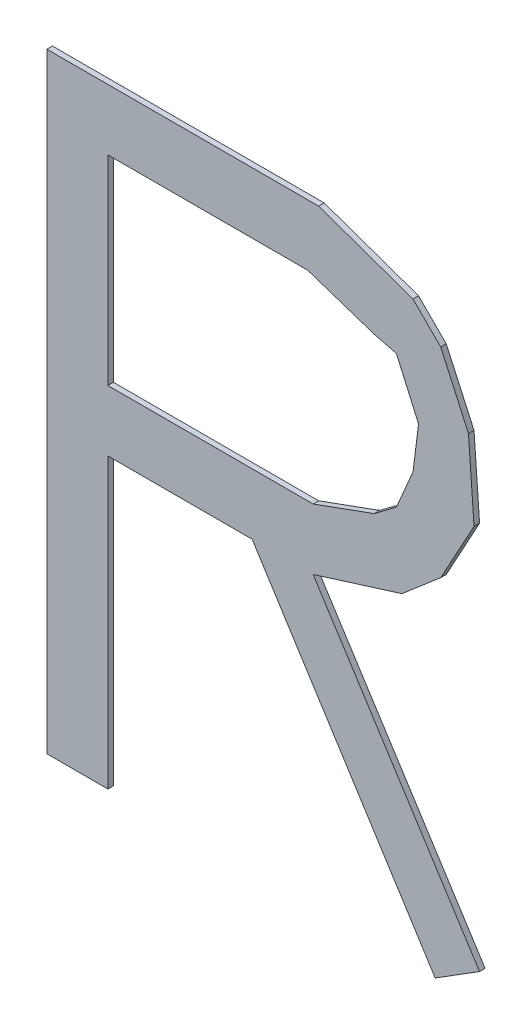
ISO-10303-21;
HEADER;
FILE_DESCRIPTION(('STEP AP214'),'2;1');
FILE_NAME('part.step','',(''),(''),'','','');
FILE_SCHEMA(('AUTOMOTIVE_DESIGN { 1 0 10303 214 1 1 1 1 }'));
ENDSEC;
DATA;
#1=APPLICATION_CONTEXT('core data for automotive mechanical design processes');
#2=APPLICATION_PROTOCOL_DEFINITION('international standard','automotive_design',2000,#1);
#3=PRODUCT_CONTEXT('',#1,'mechanical');
#4=PRODUCT('Part','Part','',(#3));
#5=PRODUCT_RELATED_PRODUCT_CATEGORY('part','',(#4));
#6=PRODUCT_DEFINITION_FORMATION('','',#4);
#7=PRODUCT_DEFINITION_CONTEXT('part definition',#1,'design');
#8=PRODUCT_DEFINITION('design','',#6,#7);
#9=PRODUCT_DEFINITION_SHAPE('','',#8);
#10=(LENGTH_UNIT() NAMED_UNIT(*) SI_UNIT(.MILLI.,.METRE.));
#11=(NAMED_UNIT(*) PLANE_ANGLE_UNIT() SI_UNIT($,.RADIAN.));
#12=(NAMED_UNIT(*) SI_UNIT($,.STERADIAN.) SOLID_ANGLE_UNIT());
#13=UNCERTAINTY_MEASURE_WITH_UNIT(LENGTH_MEASURE(1.E-05),#10,'distance_accuracy_value','');
#14=(GEOMETRIC_REPRESENTATION_CONTEXT(3) GLOBAL_UNCERTAINTY_ASSIGNED_CONTEXT((#13)) GLOBAL_UNIT_ASSIGNED_CONTEXT((#10,
#11,#12)) REPRESENTATION_CONTEXT('',''));
#15=CARTESIAN_POINT('',(0.,0.,0.));
#16=DIRECTION('',(0.,0.,1.));
#17=DIRECTION('',(1.,0.,0.));
#18=AXIS2_PLACEMENT_3D('',#15,#16,#17);
#19=CARTESIAN_POINT('',(-0.27999944,-0.02999994,0.));
#20=DIRECTION('',(-1.,0.,0.));
#21=DIRECTION('',(0.,0.,1.));
#22=AXIS2_PLACEMENT_3D('',#19,#20,#21);
#23=PLANE('',#22);
#24=DIRECTION('',(0.,0.,1.));
#25=VECTOR('',#24,1.);
#26=CARTESIAN_POINT('',(-0.27999944,0.07999984,0.));
#27=LINE('',#26,#25);
#28=CARTESIAN_POINT('',(-0.27999944,0.07999984,0.));
#29=VERTEX_POINT('',#28);
#30=CARTESIAN_POINT('',(-0.27999944,0.07999984,0.01));
#31=VERTEX_POINT('',#30);
#32=EDGE_CURVE('E331',#29,#31,#27,.T.);
#33=ORIENTED_EDGE('',*,*,#32,.F.);
#34=DIRECTION('',(0.,1.,0.));
#35=VECTOR('',#34,1.);
#36=CARTESIAN_POINT('',(-0.27999944,0.44000166,0.));
#37=LINE('',#36,#35);
#38=CARTESIAN_POINT('',(-0.27999944,-0.02999994,0.));
#39=VERTEX_POINT('',#38);
#40=EDGE_CURVE('E326',#39,#29,#37,.T.);
#41=ORIENTED_EDGE('',*,*,#40,.F.);
#42=DIRECTION('',(0.,0.,-1.));
#43=VECTOR('',#42,1.);
#44=CARTESIAN_POINT('',(-0.27999944,-0.02999994,0.));
#45=LINE('',#44,#43);
#46=CARTESIAN_POINT('',(-0.27999944,-0.02999994,0.01));
#47=VERTEX_POINT('',#46);
#48=EDGE_CURVE('E322',#47,#39,#45,.T.);
#49=ORIENTED_EDGE('',*,*,#48,.F.);
#50=DIRECTION('',(0.,1.,0.));
#51=VECTOR('',#50,1.);
#52=CARTESIAN_POINT('',(-0.27999944,0.44000166,0.01));
#53=LINE('',#52,#51);
#54=EDGE_CURVE('E212',#31,#47,#53,.F.);
#55=ORIENTED_EDGE('',*,*,#54,.F.);
#56=EDGE_LOOP('',(#33,#41,#49,#55));
#57=FACE_BOUND('',#56,.T.);
#58=ADVANCED_FACE('F17',(#57),#23,.T.);
#59=CARTESIAN_POINT('',(-0.38999922,-0.5499989,0.01));
#60=DIRECTION('',(0.,0.,1.));
#61=DIRECTION('',(1.,0.,0.));
#62=AXIS2_PLACEMENT_3D('',#59,#60,#61);
#63=PLANE('',#62);
#64=DIRECTION('',(0.,1.,0.));
#65=VECTOR('',#64,1.);
#66=CARTESIAN_POINT('',(-0.38999922,-0.5499989,0.01));
#67=LINE('',#66,#65);
#68=CARTESIAN_POINT('',(-0.38999922,-0.5499989,0.01));
#69=VERTEX_POINT('',#68);
#70=CARTESIAN_POINT('',(-0.38999922,0.55000144,0.01));
#71=VERTEX_POINT('',#70);
#72=EDGE_CURVE('E286',#69,#71,#67,.T.);
#73=ORIENTED_EDGE('',*,*,#72,.F.);
#74=DIRECTION('',(1.,0.,0.));
#75=VECTOR('',#74,1.);
#76=CARTESIAN_POINT('',(-0.27999944,-0.5499989,0.01));
#77=LINE('',#76,#75);
#78=CARTESIAN_POINT('',(-0.27999944,-0.5499989,0.01));
#79=VERTEX_POINT('',#78);
#80=EDGE_CURVE('E283',#79,#69,#77,.F.);
#81=ORIENTED_EDGE('',*,*,#80,.F.);
#82=DIRECTION('',(0.,1.,0.));
#83=VECTOR('',#82,1.);
#84=CARTESIAN_POINT('',(-0.27999944,0.44000166,0.01));
#85=LINE('',#84,#83);
#86=EDGE_CURVE('E213',#47,#79,#85,.F.);
#87=ORIENTED_EDGE('',*,*,#86,.F.);
#88=DIRECTION('',(1.,0.,0.));
#89=VECTOR('',#88,1.);
#90=CARTESIAN_POINT('',(-0.01999995999998,-0.02999994,0.01));
#91=LINE('',#90,#89);
#92=CARTESIAN_POINT('',(-0.0199999599997233,-0.0299999399999323,0.01));
#93=VERTEX_POINT('',#92);
#94=EDGE_CURVE('E323',#93,#47,#91,.F.);
#95=ORIENTED_EDGE('',*,*,#94,.F.);
#96=DIRECTION('',(0.535824439731107,-0.844329420183168,0.));
#97=VECTOR('',#96,1.);
#98=CARTESIAN_POINT('',(0.30999938,-0.5499989,0.01));
#99=LINE('',#98,#97);
#100=CARTESIAN_POINT('',(0.309999379999995,-0.549998899999992,0.01));
#101=VERTEX_POINT('',#100);
#102=EDGE_CURVE('E320',#101,#93,#99,.F.);
#103=ORIENTED_EDGE('',*,*,#102,.F.);
#104=DIRECTION('',(0.847998304005144,0.52999894000309,0.));
#105=VECTOR('',#104,1.);
#106=CARTESIAN_POINT('',(0.38999922,-0.499999,0.01));
#107=LINE('',#106,#105);
#108=CARTESIAN_POINT('',(0.389999219999949,-0.499999000000032,0.01));
#109=VERTEX_POINT('',#108);
#110=EDGE_CURVE('E317',#109,#101,#107,.F.);
#111=ORIENTED_EDGE('',*,*,#110,.F.);
#112=DIRECTION('',(-0.538035452921774,0.842922209577646,0.));
#113=VECTOR('',#112,1.);
#114=CARTESIAN_POINT('',(0.08999982,-0.02999994,0.01));
#115=LINE('',#114,#113);
#116=CARTESIAN_POINT('',(0.0899998200000002,-0.0299999400000004,0.01));
#117=VERTEX_POINT('',#116);
#118=EDGE_CURVE('E314',#117,#109,#115,.F.);
#119=ORIENTED_EDGE('',*,*,#118,.F.);
#120=DIRECTION('',(0.954479978035012,0.298274993136004,0.));
#121=VECTOR('',#120,1.);
#122=CARTESIAN_POINT('',(0.2499995,0.01999996000001,0.01));
#123=LINE('',#122,#121);
#124=CARTESIAN_POINT('',(0.249999500000042,0.01999996000001,0.01));
#125=VERTEX_POINT('',#124);
#126=EDGE_CURVE('E311',#125,#117,#123,.F.);
#127=ORIENTED_EDGE('',*,*,#126,.F.);
#128=DIRECTION('',(0.759256602365155,0.650791373456133,0.));
#129=VECTOR('',#128,1.);
#130=CARTESIAN_POINT('',(0.31999936,0.07999984,0.01));
#131=LINE('',#130,#129);
#132=CARTESIAN_POINT('',(0.319999359999925,0.0799998399999664,0.01));
#133=VERTEX_POINT('',#132);
#134=EDGE_CURVE('E308',#133,#125,#131,.F.);
#135=ORIENTED_EDGE('',*,*,#134,.F.);
#136=DIRECTION('',(0.478843609055052,0.877900221020095,0.));
#137=VECTOR('',#136,1.);
#138=CARTESIAN_POINT('',(0.37999924,0.19000216,0.01));
#139=LINE('',#138,#137);
#140=CARTESIAN_POINT('',(0.379999239999999,0.190002159999999,0.01));
#141=VERTEX_POINT('',#140);
#142=EDGE_CURVE('E305',#141,#133,#139,.F.);
#143=ORIENTED_EDGE('',*,*,#142,.F.);
#144=DIRECTION('',(-0.0712470499879011,0.997458699830736,0.));
#145=VECTOR('',#144,1.);
#146=CARTESIAN_POINT('',(0.36999926,0.33000188,0.01));
#147=LINE('',#146,#145);
#148=CARTESIAN_POINT('',(0.369999259999986,0.330001879999934,0.01));
#149=VERTEX_POINT('',#148);
#150=EDGE_CURVE('E302',#149,#141,#147,.F.);
#151=ORIENTED_EDGE('',*,*,#150,.F.);
#152=DIRECTION('',(-0.413802944300883,0.910366477462742,0.));
#153=VECTOR('',#152,1.);
#154=CARTESIAN_POINT('',(0.31999936,0.44000166,0.01));
#155=LINE('',#154,#153);
#156=CARTESIAN_POINT('',(0.319999359999988,0.440001660000083,0.01));
#157=VERTEX_POINT('',#156);
#158=EDGE_CURVE('E299',#157,#149,#155,.F.);
#159=ORIENTED_EDGE('',*,*,#158,.F.);
#160=DIRECTION('',(-0.707106781187048,0.707106781186048,0.));
#161=VECTOR('',#160,1.);
#162=CARTESIAN_POINT('',(0.26999946,0.49000156,0.01));
#163=LINE('',#162,#161);
#164=CARTESIAN_POINT('',(0.269999459999978,0.490001560000043,0.01));
#165=VERTEX_POINT('',#164);
#166=EDGE_CURVE('E296',#165,#157,#163,.F.);
#167=ORIENTED_EDGE('',*,*,#166,.F.);
#168=DIRECTION('',(-0.942990333582945,0.332820117734981,0.));
#169=VECTOR('',#168,1.);
#170=CARTESIAN_POINT('',(0.09999980000001,0.55000144,0.01));
#171=LINE('',#170,#169);
#172=CARTESIAN_POINT('',(0.09999980000001,0.55000144,0.01));
#173=VERTEX_POINT('',#172);
#174=EDGE_CURVE('E293',#173,#165,#171,.F.);
#175=ORIENTED_EDGE('',*,*,#174,.F.);
#176=DIRECTION('',(1.,0.,0.));
#177=VECTOR('',#176,1.);
#178=CARTESIAN_POINT('',(-0.38999922,0.55000144,0.01));
#179=LINE('',#178,#177);
#180=EDGE_CURVE('E290',#71,#173,#179,.T.);
#181=ORIENTED_EDGE('',*,*,#180,.F.);
#182=EDGE_LOOP('',(#73,#81,#87,#95,#103,#111,#119,#127,#135,#143,#151,#159,#167,#175,#181));
#183=FACE_BOUND('',#182,.T.);
#184=DIRECTION('',(-0.939793423488291,-0.341743063087106,0.));
#185=VECTOR('',#184,1.);
#186=CARTESIAN_POINT('',(0.08999982,0.07999984,0.01));
#187=LINE('',#186,#185);
#188=CARTESIAN_POINT('',(0.0899998199999998,0.07999984,0.01));
#189=VERTEX_POINT('',#188);
#190=CARTESIAN_POINT('',(0.19999960000006,0.119999760000075,0.01));
#191=VERTEX_POINT('',#190);
#192=EDGE_CURVE('E332',#189,#191,#187,.F.);
#193=ORIENTED_EDGE('',*,*,#192,.F.);
#194=DIRECTION('',(1.,0.,0.));
#195=VECTOR('',#194,1.);
#196=CARTESIAN_POINT('',(-0.27999944,0.07999984,0.01));
#197=LINE('',#196,#195);
#198=EDGE_CURVE('E329',#31,#189,#197,.T.);
#199=ORIENTED_EDGE('',*,*,#198,.F.);
#200=DIRECTION('',(0.,1.,0.));
#201=VECTOR('',#200,1.);
#202=CARTESIAN_POINT('',(-0.27999944,0.44000166,0.01));
#203=LINE('',#202,#201);
#204=CARTESIAN_POINT('',(-0.27999944,0.44000166,0.01));
#205=VERTEX_POINT('',#204);
#206=EDGE_CURVE('E196',#205,#31,#203,.F.);
#207=ORIENTED_EDGE('',*,*,#206,.F.);
#208=DIRECTION('',(1.,0.,0.));
#209=VECTOR('',#208,1.);
#210=CARTESIAN_POINT('',(0.07999984000003,0.44000166,0.01));
#211=LINE('',#210,#209);
#212=CARTESIAN_POINT('',(0.0799998400000135,0.440001659999996,0.01));
#213=VERTEX_POINT('',#212);
#214=EDGE_CURVE('E20',#213,#205,#211,.F.);
#215=ORIENTED_EDGE('',*,*,#214,.F.);
#216=DIRECTION('',(0.948683298050514,-0.316227766016838,0.));
#217=VECTOR('',#216,1.);
#218=CARTESIAN_POINT('',(0.1999996,0.40000174,0.01));
#219=LINE('',#218,#217);
#220=CARTESIAN_POINT('',(0.199999600000061,0.400001739999974,0.01));
#221=VERTEX_POINT('',#220);
#222=EDGE_CURVE('E180',#221,#213,#219,.F.);
#223=ORIENTED_EDGE('',*,*,#222,.F.);
#224=DIRECTION('',(0.970142500145391,-0.242535625036098,0.));
#225=VECTOR('',#224,1.);
#226=CARTESIAN_POINT('',(0.23999952,0.39000176,0.01));
#227=LINE('',#226,#225);
#228=CARTESIAN_POINT('',(0.239999520000032,0.390001760000001,0.01));
#229=VERTEX_POINT('',#228);
#230=EDGE_CURVE('E203',#229,#221,#227,.F.);
#231=ORIENTED_EDGE('',*,*,#230,.F.);
#232=DIRECTION('',(0.406138466053169,-0.913811548620381,0.));
#233=VECTOR('',#232,1.);
#234=CARTESIAN_POINT('',(0.27999944,0.30000194,0.01));
#235=LINE('',#234,#233);
#236=CARTESIAN_POINT('',(0.279999439999982,0.300001940000019,0.01));
#237=VERTEX_POINT('',#236);
#238=EDGE_CURVE('E345',#237,#229,#235,.F.);
#239=ORIENTED_EDGE('',*,*,#238,.F.);
#240=DIRECTION('',(-0.124034734588962,-0.992277876713698,0.));
#241=VECTOR('',#240,1.);
#242=CARTESIAN_POINT('',(0.26999946,0.2200021,0.01));
#243=LINE('',#242,#241);
#244=CARTESIAN_POINT('',(0.269999459999997,0.220002100000024,0.01));
#245=VERTEX_POINT('',#244);
#246=EDGE_CURVE('E342',#245,#237,#243,.F.);
#247=ORIENTED_EDGE('',*,*,#246,.F.);
#248=DIRECTION('',(-0.393907223227035,-0.919150205075083,0.));
#249=VECTOR('',#248,1.);
#250=CARTESIAN_POINT('',(0.23999952,0.1499997,0.01));
#251=LINE('',#250,#249);
#252=CARTESIAN_POINT('',(0.23999952,0.1499997,0.01));
#253=VERTEX_POINT('',#252);
#254=EDGE_CURVE('E339',#253,#245,#251,.F.);
#255=ORIENTED_EDGE('',*,*,#254,.F.);
#256=DIRECTION('',(-0.8,-0.6,0.));
#257=VECTOR('',#256,1.);
#258=CARTESIAN_POINT('',(0.1999996,0.11999976,0.01));
#259=LINE('',#258,#257);
#260=EDGE_CURVE('E336',#191,#253,#259,.F.);
#261=ORIENTED_EDGE('',*,*,#260,.F.);
#262=EDGE_LOOP('',(#193,#199,#207,#215,#223,#231,#239,#247,#255,#261));
#263=FACE_BOUND('',#262,.T.);
#264=ADVANCED_FACE('F193',(#183,#263),#63,.T.);
#265=CARTESIAN_POINT('',(0.07999984000003,0.44000166,0.));
#266=DIRECTION('',(0.,-1.,0.));
#267=DIRECTION('',(0.,0.,-1.));
#268=AXIS2_PLACEMENT_3D('',#265,#266,#267);
#269=PLANE('',#268);
#270=DIRECTION('',(0.,0.,-1.));
#271=VECTOR('',#270,1.);
#272=CARTESIAN_POINT('',(-0.27999944,0.44000166,0.));
#273=LINE('',#272,#271);
#274=CARTESIAN_POINT('',(-0.27999944,0.44000166,0.));
#275=VERTEX_POINT('',#274);
#276=EDGE_CURVE('E209',#275,#205,#273,.F.);
#277=ORIENTED_EDGE('',*,*,#276,.F.);
#278=DIRECTION('',(1.,0.,0.));
#279=VECTOR('',#278,1.);
#280=CARTESIAN_POINT('',(0.07999984000003,0.44000166,0.));
#281=LINE('',#280,#279);
#282=CARTESIAN_POINT('',(0.0799998400000135,0.440001659999996,0.));
#283=VERTEX_POINT('',#282);
#284=EDGE_CURVE('E202',#275,#283,#281,.T.);
#285=ORIENTED_EDGE('',*,*,#284,.T.);
#286=DIRECTION('',(0.,0.,1.));
#287=VECTOR('',#286,1.);
#288=CARTESIAN_POINT('',(0.079999840000027,0.440001659999991,0.));
#289=LINE('',#288,#287);
#290=EDGE_CURVE('E185',#213,#283,#289,.F.);
#291=ORIENTED_EDGE('',*,*,#290,.F.);
#292=ORIENTED_EDGE('',*,*,#214,.T.);
#293=EDGE_LOOP('',(#277,#285,#291,#292));
#294=FACE_BOUND('',#293,.T.);
#295=ADVANCED_FACE('F200',(#294),#269,.T.);
#296=CARTESIAN_POINT('',(0.1999996,0.40000174,0.));
#297=DIRECTION('',(-0.316227766016838,-0.948683298050514,0.));
#298=DIRECTION('',(0.948683298050514,-0.316227766016838,0.));
#299=AXIS2_PLACEMENT_3D('',#296,#297,#298);
#300=PLANE('',#299);
#301=ORIENTED_EDGE('',*,*,#290,.T.);
#302=DIRECTION('',(0.948683298050514,-0.316227766016838,0.));
#303=VECTOR('',#302,1.);
#304=CARTESIAN_POINT('',(0.1999996,0.40000174,0.));
#305=LINE('',#304,#303);
#306=CARTESIAN_POINT('',(0.199999600000061,0.400001739999974,0.));
#307=VERTEX_POINT('',#306);
#308=EDGE_CURVE('E277',#283,#307,#305,.T.);
#309=ORIENTED_EDGE('',*,*,#308,.T.);
#310=DIRECTION('',(0.,0.,1.));
#311=VECTOR('',#310,1.);
#312=CARTESIAN_POINT('',(0.199999599999998,0.40000173999999,0.));
#313=LINE('',#312,#311);
#314=EDGE_CURVE('E187',#221,#307,#313,.F.);
#315=ORIENTED_EDGE('',*,*,#314,.F.);
#316=ORIENTED_EDGE('',*,*,#222,.T.);
#317=EDGE_LOOP('',(#301,#309,#315,#316));
#318=FACE_BOUND('',#317,.T.);
#319=ADVANCED_FACE('F182',(#318),#300,.T.);
#320=CARTESIAN_POINT('',(0.23999952,0.39000176,0.));
#321=DIRECTION('',(-0.242535625036098,-0.970142500145391,0.));
#322=DIRECTION('',(0.970142500145391,-0.242535625036098,0.));
#323=AXIS2_PLACEMENT_3D('',#320,#321,#322);
#324=PLANE('',#323);
#325=ORIENTED_EDGE('',*,*,#314,.T.);
#326=DIRECTION('',(0.970142500145391,-0.242535625036098,0.));
#327=VECTOR('',#326,1.);
#328=CARTESIAN_POINT('',(0.23999952,0.39000176,0.));
#329=LINE('',#328,#327);
#330=CARTESIAN_POINT('',(0.239999520000032,0.390001760000001,0.));
#331=VERTEX_POINT('',#330);
#332=EDGE_CURVE('E274',#307,#331,#329,.T.);
#333=ORIENTED_EDGE('',*,*,#332,.T.);
#334=DIRECTION('',(0.,0.,1.));
#335=VECTOR('',#334,1.);
#336=CARTESIAN_POINT('',(0.239999520000027,0.390001760000012,0.));
#337=LINE('',#336,#335);
#338=EDGE_CURVE('E344',#229,#331,#337,.F.);
#339=ORIENTED_EDGE('',*,*,#338,.F.);
#340=ORIENTED_EDGE('',*,*,#230,.T.);
#341=EDGE_LOOP('',(#325,#333,#339,#340));
#342=FACE_BOUND('',#341,.T.);
#343=ADVANCED_FACE('F351',(#342),#324,.T.);
#344=CARTESIAN_POINT('',(0.27999944,0.30000194,0.));
#345=DIRECTION('',(-0.913811548620381,-0.406138466053169,0.));
#346=DIRECTION('',(0.406138466053169,-0.913811548620381,0.));
#347=AXIS2_PLACEMENT_3D('',#344,#345,#346);
#348=PLANE('',#347);
#349=ORIENTED_EDGE('',*,*,#338,.T.);
#350=DIRECTION('',(0.406138466053169,-0.913811548620381,0.));
#351=VECTOR('',#350,1.);
#352=CARTESIAN_POINT('',(0.27999944,0.30000194,0.));
#353=LINE('',#352,#351);
#354=CARTESIAN_POINT('',(0.279999439999982,0.300001940000019,0.));
#355=VERTEX_POINT('',#354);
#356=EDGE_CURVE('E271',#331,#355,#353,.T.);
#357=ORIENTED_EDGE('',*,*,#356,.T.);
#358=DIRECTION('',(0.,0.,1.));
#359=VECTOR('',#358,1.);
#360=CARTESIAN_POINT('',(0.27999943999998,0.300001940000003,0.));
#361=LINE('',#360,#359);
#362=EDGE_CURVE('E341',#237,#355,#361,.F.);
#363=ORIENTED_EDGE('',*,*,#362,.F.);
#364=ORIENTED_EDGE('',*,*,#238,.T.);
#365=EDGE_LOOP('',(#349,#357,#363,#364));
#366=FACE_BOUND('',#365,.T.);
#367=ADVANCED_FACE('F359',(#366),#348,.T.);
#368=CARTESIAN_POINT('',(0.26999946,0.2200021,0.));
#369=DIRECTION('',(-0.992277876713698,0.124034734588962,0.));
#370=DIRECTION('',(-0.124034734588962,-0.992277876713698,0.));
#371=AXIS2_PLACEMENT_3D('',#368,#369,#370);
#372=PLANE('',#371);
#373=ORIENTED_EDGE('',*,*,#362,.T.);
#374=DIRECTION('',(-0.124034734588962,-0.992277876713698,0.));
#375=VECTOR('',#374,1.);
#376=CARTESIAN_POINT('',(0.26999946,0.2200021,0.));
#377=LINE('',#376,#375);
#378=CARTESIAN_POINT('',(0.269999459999997,0.220002100000024,0.));
#379=VERTEX_POINT('',#378);
#380=EDGE_CURVE('E268',#355,#379,#377,.T.);
#381=ORIENTED_EDGE('',*,*,#380,.T.);
#382=DIRECTION('',(0.,0.,1.));
#383=VECTOR('',#382,1.);
#384=CARTESIAN_POINT('',(0.269999459999989,0.220002100000005,0.));
#385=LINE('',#384,#383);
#386=EDGE_CURVE('E338',#245,#379,#385,.F.);
#387=ORIENTED_EDGE('',*,*,#386,.F.);
#388=ORIENTED_EDGE('',*,*,#246,.T.);
#389=EDGE_LOOP('',(#373,#381,#387,#388));
#390=FACE_BOUND('',#389,.T.);
#391=ADVANCED_FACE('F479',(#390),#372,.T.);
#392=CARTESIAN_POINT('',(0.23999952,0.1499997,0.));
#393=DIRECTION('',(-0.919150205075083,0.393907223227035,0.));
#394=DIRECTION('',(-0.393907223227035,-0.919150205075083,0.));
#395=AXIS2_PLACEMENT_3D('',#392,#393,#394);
#396=PLANE('',#395);
#397=ORIENTED_EDGE('',*,*,#386,.T.);
#398=DIRECTION('',(-0.393907223227035,-0.919150205075083,0.));
#399=VECTOR('',#398,1.);
#400=CARTESIAN_POINT('',(0.23999952,0.1499997,0.));
#401=LINE('',#400,#399);
#402=CARTESIAN_POINT('',(0.23999952,0.1499997,0.));
#403=VERTEX_POINT('',#402);
#404=EDGE_CURVE('E265',#379,#403,#401,.T.);
#405=ORIENTED_EDGE('',*,*,#404,.T.);
#406=DIRECTION('',(0.,0.,1.));
#407=VECTOR('',#406,1.);
#408=CARTESIAN_POINT('',(0.23999952,0.1499997,0.));
#409=LINE('',#408,#407);
#410=EDGE_CURVE('E335',#253,#403,#409,.F.);
#411=ORIENTED_EDGE('',*,*,#410,.F.);
#412=ORIENTED_EDGE('',*,*,#254,.T.);
#413=EDGE_LOOP('',(#397,#405,#411,#412));
#414=FACE_BOUND('',#413,.T.);
#415=ADVANCED_FACE('F476',(#414),#396,.T.);
#416=CARTESIAN_POINT('',(0.1999996,0.11999976,0.));
#417=DIRECTION('',(-0.6,0.8,0.));
#418=DIRECTION('',(-0.8,-0.6,0.));
#419=AXIS2_PLACEMENT_3D('',#416,#417,#418);
#420=PLANE('',#419);
#421=ORIENTED_EDGE('',*,*,#410,.T.);
#422=DIRECTION('',(-0.8,-0.6,0.));
#423=VECTOR('',#422,1.);
#424=CARTESIAN_POINT('',(0.1999996,0.11999976,0.));
#425=LINE('',#424,#423);
#426=CARTESIAN_POINT('',(0.19999960000006,0.119999760000075,0.));
#427=VERTEX_POINT('',#426);
#428=EDGE_CURVE('E262',#403,#427,#425,.T.);
#429=ORIENTED_EDGE('',*,*,#428,.T.);
#430=DIRECTION('',(0.,0.,1.));
#431=VECTOR('',#430,1.);
#432=CARTESIAN_POINT('',(0.199999599999983,0.119999760000047,0.));
#433=LINE('',#432,#431);
#434=EDGE_CURVE('E334',#191,#427,#433,.F.);
#435=ORIENTED_EDGE('',*,*,#434,.F.);
#436=ORIENTED_EDGE('',*,*,#260,.T.);
#437=EDGE_LOOP('',(#421,#429,#435,#436));
#438=FACE_BOUND('',#437,.T.);
#439=ADVANCED_FACE('F472',(#438),#420,.T.);
#440=CARTESIAN_POINT('',(0.08999982,0.07999984,0.));
#441=DIRECTION('',(-0.341743063087106,0.939793423488291,0.));
#442=DIRECTION('',(-0.939793423488291,-0.341743063087106,0.));
#443=AXIS2_PLACEMENT_3D('',#440,#441,#442);
#444=PLANE('',#443);
#445=ORIENTED_EDGE('',*,*,#434,.T.);
#446=DIRECTION('',(-0.939793423488291,-0.341743063087106,0.));
#447=VECTOR('',#446,1.);
#448=CARTESIAN_POINT('',(0.08999982,0.07999984,0.));
#449=LINE('',#448,#447);
#450=CARTESIAN_POINT('',(0.0899998199999998,0.07999984,0.));
#451=VERTEX_POINT('',#450);
#452=EDGE_CURVE('E259',#427,#451,#449,.T.);
#453=ORIENTED_EDGE('',*,*,#452,.T.);
#454=DIRECTION('',(0.,0.,1.));
#455=VECTOR('',#454,1.);
#456=CARTESIAN_POINT('',(0.08999982,0.07999984,0.));
#457=LINE('',#456,#455);
#458=EDGE_CURVE('E211',#189,#451,#457,.F.);
#459=ORIENTED_EDGE('',*,*,#458,.F.);
#460=ORIENTED_EDGE('',*,*,#192,.T.);
#461=EDGE_LOOP('',(#445,#453,#459,#460));
#462=FACE_BOUND('',#461,.T.);
#463=ADVANCED_FACE('F467',(#462),#444,.T.);
#464=CARTESIAN_POINT('',(-0.27999944,0.07999984,0.));
#465=DIRECTION('',(0.,1.,0.));
#466=DIRECTION('',(0.,0.,1.));
#467=AXIS2_PLACEMENT_3D('',#464,#465,#466);
#468=PLANE('',#467);
#469=ORIENTED_EDGE('',*,*,#458,.T.);
#470=DIRECTION('',(1.,0.,0.));
#471=VECTOR('',#470,1.);
#472=CARTESIAN_POINT('',(-0.27999944,0.07999984,0.));
#473=LINE('',#472,#471);
#474=EDGE_CURVE('E256',#451,#29,#473,.F.);
#475=ORIENTED_EDGE('',*,*,#474,.T.);
#476=ORIENTED_EDGE('',*,*,#32,.T.);
#477=ORIENTED_EDGE('',*,*,#198,.T.);
#478=EDGE_LOOP('',(#469,#475,#476,#477));
#479=FACE_BOUND('',#478,.T.);
#480=ADVANCED_FACE('F464',(#479),#468,.T.);
#481=CARTESIAN_POINT('',(-0.27999944,0.44000166,0.));
#482=DIRECTION('',(1.,0.,0.));
#483=DIRECTION('',(0.,0.,-1.));
#484=AXIS2_PLACEMENT_3D('',#481,#482,#483);
#485=PLANE('',#484);
#486=ORIENTED_EDGE('',*,*,#40,.T.);
#487=DIRECTION('',(0.,1.,0.));
#488=VECTOR('',#487,1.);
#489=CARTESIAN_POINT('',(-0.27999944,0.44000166,0.));
#490=LINE('',#489,#488);
#491=EDGE_CURVE('E280',#29,#275,#490,.T.);
#492=ORIENTED_EDGE('',*,*,#491,.T.);
#493=ORIENTED_EDGE('',*,*,#276,.T.);
#494=ORIENTED_EDGE('',*,*,#206,.T.);
#495=ORIENTED_EDGE('',*,*,#54,.T.);
#496=ORIENTED_EDGE('',*,*,#86,.T.);
#497=DIRECTION('',(0.,0.,-1.));
#498=VECTOR('',#497,1.);
#499=CARTESIAN_POINT('',(-0.27999944,-0.5499989,0.));
#500=LINE('',#499,#498);
#501=CARTESIAN_POINT('',(-0.27999944,-0.5499989,0.));
#502=VERTEX_POINT('',#501);
#503=EDGE_CURVE('E285',#502,#79,#500,.F.);
#504=ORIENTED_EDGE('',*,*,#503,.F.);
#505=DIRECTION('',(0.,1.,0.));
#506=VECTOR('',#505,1.);
#507=CARTESIAN_POINT('',(-0.27999944,0.44000166,0.));
#508=LINE('',#507,#506);
#509=EDGE_CURVE('E253',#502,#39,#508,.T.);
#510=ORIENTED_EDGE('',*,*,#509,.T.);
#511=EDGE_LOOP('',(#486,#492,#493,#494,#495,#496,#504,#510));
#512=FACE_BOUND('',#511,.T.);
#513=ADVANCED_FACE('F457',(#512),#485,.T.);
#514=CARTESIAN_POINT('',(-0.01999995999998,-0.02999994,0.));
#515=DIRECTION('',(0.,-1.,0.));
#516=DIRECTION('',(0.,0.,-1.));
#517=AXIS2_PLACEMENT_3D('',#514,#515,#516);
#518=PLANE('',#517);
#519=ORIENTED_EDGE('',*,*,#48,.T.);
#520=DIRECTION('',(1.,0.,0.));
#521=VECTOR('',#520,1.);
#522=CARTESIAN_POINT('',(-0.01999995999998,-0.02999994,0.));
#523=LINE('',#522,#521);
#524=CARTESIAN_POINT('',(-0.0199999599997233,-0.0299999399999323,0.));
#525=VERTEX_POINT('',#524);
#526=EDGE_CURVE('E250',#39,#525,#523,.T.);
#527=ORIENTED_EDGE('',*,*,#526,.T.);
#528=DIRECTION('',(0.,0.,1.));
#529=VECTOR('',#528,1.);
#530=CARTESIAN_POINT('',(-0.0199999599997663,-0.0299999399998645,0.));
#531=LINE('',#530,#529);
#532=EDGE_CURVE('E319',#93,#525,#531,.F.);
#533=ORIENTED_EDGE('',*,*,#532,.F.);
#534=ORIENTED_EDGE('',*,*,#94,.T.);
#535=EDGE_LOOP('',(#519,#527,#533,#534));
#536=FACE_BOUND('',#535,.T.);
#537=ADVANCED_FACE('F454',(#536),#518,.T.);
#538=CARTESIAN_POINT('',(0.30999938,-0.5499989,0.));
#539=DIRECTION('',(-0.844329420183168,-0.535824439731107,0.));
#540=DIRECTION('',(0.535824439731107,-0.844329420183168,0.));
#541=AXIS2_PLACEMENT_3D('',#538,#539,#540);
#542=PLANE('',#541);
#543=ORIENTED_EDGE('',*,*,#532,.T.);
#544=DIRECTION('',(0.535824439731107,-0.844329420183168,0.));
#545=VECTOR('',#544,1.);
#546=CARTESIAN_POINT('',(0.30999938,-0.5499989,0.));
#547=LINE('',#546,#545);
#548=CARTESIAN_POINT('',(0.309999379999995,-0.549998899999992,0.));
#549=VERTEX_POINT('',#548);
#550=EDGE_CURVE('E247',#525,#549,#547,.T.);
#551=ORIENTED_EDGE('',*,*,#550,.T.);
#552=DIRECTION('',(0.,0.,1.));
#553=VECTOR('',#552,1.);
#554=CARTESIAN_POINT('',(0.309999379999995,-0.549998899999992,0.));
#555=LINE('',#554,#553);
#556=EDGE_CURVE('E316',#101,#549,#555,.F.);
#557=ORIENTED_EDGE('',*,*,#556,.F.);
#558=ORIENTED_EDGE('',*,*,#102,.T.);
#559=EDGE_LOOP('',(#543,#551,#557,#558));
#560=FACE_BOUND('',#559,.T.);
#561=ADVANCED_FACE('F451',(#560),#542,.T.);
#562=CARTESIAN_POINT('',(0.38999922,-0.499999,0.));
#563=DIRECTION('',(0.52999894000309,-0.847998304005144,0.));
#564=DIRECTION('',(0.847998304005144,0.52999894000309,0.));
#565=AXIS2_PLACEMENT_3D('',#562,#563,#564);
#566=PLANE('',#565);
#567=ORIENTED_EDGE('',*,*,#556,.T.);
#568=DIRECTION('',(0.847998304005144,0.52999894000309,0.));
#569=VECTOR('',#568,1.);
#570=CARTESIAN_POINT('',(0.38999922,-0.499999,0.));
#571=LINE('',#570,#569);
#572=CARTESIAN_POINT('',(0.389999219999949,-0.499999000000032,0.));
#573=VERTEX_POINT('',#572);
#574=EDGE_CURVE('E244',#549,#573,#571,.T.);
#575=ORIENTED_EDGE('',*,*,#574,.T.);
#576=DIRECTION('',(0.,0.,1.));
#577=VECTOR('',#576,1.);
#578=CARTESIAN_POINT('',(0.389999219999949,-0.499999000000032,0.));
#579=LINE('',#578,#577);
#580=EDGE_CURVE('E313',#109,#573,#579,.F.);
#581=ORIENTED_EDGE('',*,*,#580,.F.);
#582=ORIENTED_EDGE('',*,*,#110,.T.);
#583=EDGE_LOOP('',(#567,#575,#581,#582));
#584=FACE_BOUND('',#583,.T.);
#585=ADVANCED_FACE('F445',(#584),#566,.T.);
#586=CARTESIAN_POINT('',(0.08999982,-0.02999994,0.));
#587=DIRECTION('',(0.842922209577646,0.538035452921774,0.));
#588=DIRECTION('',(-0.538035452921774,0.842922209577646,0.));
#589=AXIS2_PLACEMENT_3D('',#586,#587,#588);
#590=PLANE('',#589);
#591=ORIENTED_EDGE('',*,*,#580,.T.);
#592=DIRECTION('',(-0.538035452921774,0.842922209577646,0.));
#593=VECTOR('',#592,1.);
#594=CARTESIAN_POINT('',(0.08999982,-0.02999994,0.));
#595=LINE('',#594,#593);
#596=CARTESIAN_POINT('',(0.0899998200000002,-0.0299999400000004,0.));
#597=VERTEX_POINT('',#596);
#598=EDGE_CURVE('E241',#573,#597,#595,.T.);
#599=ORIENTED_EDGE('',*,*,#598,.T.);
#600=DIRECTION('',(0.,0.,1.));
#601=VECTOR('',#600,1.);
#602=CARTESIAN_POINT('',(0.0899998200000001,-0.0299999400000004,0.));
#603=LINE('',#602,#601);
#604=EDGE_CURVE('E310',#117,#597,#603,.F.);
#605=ORIENTED_EDGE('',*,*,#604,.F.);
#606=ORIENTED_EDGE('',*,*,#118,.T.);
#607=EDGE_LOOP('',(#591,#599,#605,#606));
#608=FACE_BOUND('',#607,.T.);
#609=ADVANCED_FACE('F441',(#608),#590,.T.);
#610=CARTESIAN_POINT('',(0.2499995,0.01999996000001,0.));
#611=DIRECTION('',(0.298274993136004,-0.954479978035012,0.));
#612=DIRECTION('',(0.954479978035012,0.298274993136004,0.));
#613=AXIS2_PLACEMENT_3D('',#610,#611,#612);
#614=PLANE('',#613);
#615=ORIENTED_EDGE('',*,*,#604,.T.);
#616=DIRECTION('',(0.954479978035012,0.298274993136004,0.));
#617=VECTOR('',#616,1.);
#618=CARTESIAN_POINT('',(0.2499995,0.01999996000001,0.));
#619=LINE('',#618,#617);
#620=CARTESIAN_POINT('',(0.249999500000042,0.01999996000001,0.));
#621=VERTEX_POINT('',#620);
#622=EDGE_CURVE('E238',#597,#621,#619,.T.);
#623=ORIENTED_EDGE('',*,*,#622,.T.);
#624=DIRECTION('',(0.,0.,1.));
#625=VECTOR('',#624,1.);
#626=CARTESIAN_POINT('',(0.249999500000018,0.019999959999989,0.));
#627=LINE('',#626,#625);
#628=EDGE_CURVE('E307',#125,#621,#627,.F.);
#629=ORIENTED_EDGE('',*,*,#628,.F.);
#630=ORIENTED_EDGE('',*,*,#126,.T.);
#631=EDGE_LOOP('',(#615,#623,#629,#630));
#632=FACE_BOUND('',#631,.T.);
#633=ADVANCED_FACE('F435',(#632),#614,.T.);
#634=CARTESIAN_POINT('',(0.31999936,0.07999984,0.));
#635=DIRECTION('',(0.650791373456133,-0.759256602365155,0.));
#636=DIRECTION('',(0.759256602365155,0.650791373456133,0.));
#637=AXIS2_PLACEMENT_3D('',#634,#635,#636);
#638=PLANE('',#637);
#639=ORIENTED_EDGE('',*,*,#628,.T.);
#640=DIRECTION('',(0.759256602365155,0.650791373456133,0.));
#641=VECTOR('',#640,1.);
#642=CARTESIAN_POINT('',(0.31999936,0.07999984,0.));
#643=LINE('',#642,#641);
#644=CARTESIAN_POINT('',(0.319999359999925,0.0799998399999664,0.));
#645=VERTEX_POINT('',#644);
#646=EDGE_CURVE('E235',#621,#645,#643,.T.);
#647=ORIENTED_EDGE('',*,*,#646,.T.);
#648=DIRECTION('',(0.,0.,1.));
#649=VECTOR('',#648,1.);
#650=CARTESIAN_POINT('',(0.319999359999957,0.0799998400000237,0.));
#651=LINE('',#650,#649);
#652=EDGE_CURVE('E304',#133,#645,#651,.F.);
#653=ORIENTED_EDGE('',*,*,#652,.F.);
#654=ORIENTED_EDGE('',*,*,#134,.T.);
#655=EDGE_LOOP('',(#639,#647,#653,#654));
#656=FACE_BOUND('',#655,.T.);
#657=ADVANCED_FACE('F431',(#656),#638,.T.);
#658=CARTESIAN_POINT('',(0.37999924,0.19000216,0.));
#659=DIRECTION('',(0.877900221020095,-0.478843609055052,0.));
#660=DIRECTION('',(0.478843609055052,0.877900221020095,0.));
#661=AXIS2_PLACEMENT_3D('',#658,#659,#660);
#662=PLANE('',#661);
#663=ORIENTED_EDGE('',*,*,#652,.T.);
#664=DIRECTION('',(0.478843609055052,0.877900221020095,0.));
#665=VECTOR('',#664,1.);
#666=CARTESIAN_POINT('',(0.37999924,0.19000216,0.));
#667=LINE('',#666,#665);
#668=CARTESIAN_POINT('',(0.379999239999999,0.190002159999999,0.));
#669=VERTEX_POINT('',#668);
#670=EDGE_CURVE('E232',#645,#669,#667,.T.);
#671=ORIENTED_EDGE('',*,*,#670,.T.);
#672=DIRECTION('',(0.,0.,1.));
#673=VECTOR('',#672,1.);
#674=CARTESIAN_POINT('',(0.379999239999999,0.19000216,0.));
#675=LINE('',#674,#673);
#676=EDGE_CURVE('E301',#141,#669,#675,.F.);
#677=ORIENTED_EDGE('',*,*,#676,.F.);
#678=ORIENTED_EDGE('',*,*,#142,.T.);
#679=EDGE_LOOP('',(#663,#671,#677,#678));
#680=FACE_BOUND('',#679,.T.);
#681=ADVANCED_FACE('F425',(#680),#662,.T.);
#682=CARTESIAN_POINT('',(0.36999926,0.33000188,0.));
#683=DIRECTION('',(0.997458699830736,0.0712470499879011,0.));
#684=DIRECTION('',(-0.0712470499879011,0.997458699830736,0.));
#685=AXIS2_PLACEMENT_3D('',#682,#683,#684);
#686=PLANE('',#685);
#687=ORIENTED_EDGE('',*,*,#676,.T.);
#688=DIRECTION('',(-0.0712470499879011,0.997458699830736,0.));
#689=VECTOR('',#688,1.);
#690=CARTESIAN_POINT('',(0.36999926,0.33000188,0.));
#691=LINE('',#690,#689);
#692=CARTESIAN_POINT('',(0.369999259999986,0.330001879999934,0.));
#693=VERTEX_POINT('',#692);
#694=EDGE_CURVE('E229',#669,#693,#691,.T.);
#695=ORIENTED_EDGE('',*,*,#694,.T.);
#696=DIRECTION('',(0.,0.,1.));
#697=VECTOR('',#696,1.);
#698=CARTESIAN_POINT('',(0.369999259999964,0.330001879999983,0.));
#699=LINE('',#698,#697);
#700=EDGE_CURVE('E298',#149,#693,#699,.F.);
#701=ORIENTED_EDGE('',*,*,#700,.F.);
#702=ORIENTED_EDGE('',*,*,#150,.T.);
#703=EDGE_LOOP('',(#687,#695,#701,#702));
#704=FACE_BOUND('',#703,.T.);
#705=ADVANCED_FACE('F421',(#704),#686,.T.);
#706=CARTESIAN_POINT('',(0.31999936,0.44000166,0.));
#707=DIRECTION('',(0.910366477462742,0.413802944300883,0.));
#708=DIRECTION('',(-0.413802944300883,0.910366477462742,0.));
#709=AXIS2_PLACEMENT_3D('',#706,#707,#708);
#710=PLANE('',#709);
#711=ORIENTED_EDGE('',*,*,#700,.T.);
#712=DIRECTION('',(-0.413802944300883,0.910366477462742,0.));
#713=VECTOR('',#712,1.);
#714=CARTESIAN_POINT('',(0.31999936,0.44000166,0.));
#715=LINE('',#714,#713);
#716=CARTESIAN_POINT('',(0.319999359999988,0.440001660000083,0.));
#717=VERTEX_POINT('',#716);
#718=EDGE_CURVE('E226',#693,#717,#715,.T.);
#719=ORIENTED_EDGE('',*,*,#718,.T.);
#720=DIRECTION('',(0.,0.,1.));
#721=VECTOR('',#720,1.);
#722=CARTESIAN_POINT('',(0.319999360000035,0.440001660000035,0.));
#723=LINE('',#722,#721);
#724=EDGE_CURVE('E295',#157,#717,#723,.F.);
#725=ORIENTED_EDGE('',*,*,#724,.F.);
#726=ORIENTED_EDGE('',*,*,#158,.T.);
#727=EDGE_LOOP('',(#711,#719,#725,#726));
#728=FACE_BOUND('',#727,.T.);
#729=ADVANCED_FACE('F415',(#728),#710,.T.);
#730=CARTESIAN_POINT('',(0.26999946,0.49000156,0.));
#731=DIRECTION('',(0.707106781186048,0.707106781187048,0.));
#732=DIRECTION('',(-0.707106781187048,0.707106781186048,0.));
#733=AXIS2_PLACEMENT_3D('',#730,#731,#732);
#734=PLANE('',#733);
#735=ORIENTED_EDGE('',*,*,#724,.T.);
#736=DIRECTION('',(-0.707106781187048,0.707106781186048,0.));
#737=VECTOR('',#736,1.);
#738=CARTESIAN_POINT('',(0.26999946,0.49000156,0.));
#739=LINE('',#738,#737);
#740=CARTESIAN_POINT('',(0.269999459999978,0.490001560000043,0.));
#741=VERTEX_POINT('',#740);
#742=EDGE_CURVE('E223',#717,#741,#739,.T.);
#743=ORIENTED_EDGE('',*,*,#742,.T.);
#744=DIRECTION('',(0.,0.,1.));
#745=VECTOR('',#744,1.);
#746=CARTESIAN_POINT('',(0.269999460000011,0.490001560000031,0.));
#747=LINE('',#746,#745);
#748=EDGE_CURVE('E292',#165,#741,#747,.F.);
#749=ORIENTED_EDGE('',*,*,#748,.F.);
#750=ORIENTED_EDGE('',*,*,#166,.T.);
#751=EDGE_LOOP('',(#735,#743,#749,#750));
#752=FACE_BOUND('',#751,.T.);
#753=ADVANCED_FACE('F411',(#752),#734,.T.);
#754=CARTESIAN_POINT('',(0.09999980000001,0.55000144,0.));
#755=DIRECTION('',(0.332820117734981,0.942990333582945,0.));
#756=DIRECTION('',(-0.942990333582945,0.332820117734981,0.));
#757=AXIS2_PLACEMENT_3D('',#754,#755,#756);
#758=PLANE('',#757);
#759=ORIENTED_EDGE('',*,*,#748,.T.);
#760=DIRECTION('',(-0.942990333582945,0.332820117734981,0.));
#761=VECTOR('',#760,1.);
#762=CARTESIAN_POINT('',(0.09999980000001,0.55000144,0.));
#763=LINE('',#762,#761);
#764=CARTESIAN_POINT('',(0.09999980000001,0.55000144,0.));
#765=VERTEX_POINT('',#764);
#766=EDGE_CURVE('E220',#741,#765,#763,.T.);
#767=ORIENTED_EDGE('',*,*,#766,.T.);
#768=DIRECTION('',(0.,0.,1.));
#769=VECTOR('',#768,1.);
#770=CARTESIAN_POINT('',(0.09999980000001,0.55000144,0.));
#771=LINE('',#770,#769);
#772=EDGE_CURVE('E289',#173,#765,#771,.F.);
#773=ORIENTED_EDGE('',*,*,#772,.F.);
#774=ORIENTED_EDGE('',*,*,#174,.T.);
#775=EDGE_LOOP('',(#759,#767,#773,#774));
#776=FACE_BOUND('',#775,.T.);
#777=ADVANCED_FACE('F405',(#776),#758,.T.);
#778=CARTESIAN_POINT('',(-0.38999922,0.55000144,0.));
#779=DIRECTION('',(0.,1.,0.));
#780=DIRECTION('',(0.,0.,1.));
#781=AXIS2_PLACEMENT_3D('',#778,#779,#780);
#782=PLANE('',#781);
#783=ORIENTED_EDGE('',*,*,#772,.T.);
#784=DIRECTION('',(1.,0.,0.));
#785=VECTOR('',#784,1.);
#786=CARTESIAN_POINT('',(-0.38999922,0.55000144,0.));
#787=LINE('',#786,#785);
#788=CARTESIAN_POINT('',(-0.38999922,0.55000144,0.));
#789=VERTEX_POINT('',#788);
#790=EDGE_CURVE('E217',#765,#789,#787,.F.);
#791=ORIENTED_EDGE('',*,*,#790,.T.);
#792=DIRECTION('',(0.,0.,1.));
#793=VECTOR('',#792,1.);
#794=CARTESIAN_POINT('',(-0.38999922,0.55000144,0.));
#795=LINE('',#794,#793);
#796=EDGE_CURVE('E288',#71,#789,#795,.F.);
#797=ORIENTED_EDGE('',*,*,#796,.F.);
#798=ORIENTED_EDGE('',*,*,#180,.T.);
#799=EDGE_LOOP('',(#783,#791,#797,#798));
#800=FACE_BOUND('',#799,.T.);
#801=ADVANCED_FACE('F402',(#800),#782,.T.);
#802=CARTESIAN_POINT('',(-0.38999922,-0.5499989,0.));
#803=DIRECTION('',(-1.,0.,0.));
#804=DIRECTION('',(0.,0.,1.));
#805=AXIS2_PLACEMENT_3D('',#802,#803,#804);
#806=PLANE('',#805);
#807=ORIENTED_EDGE('',*,*,#796,.T.);
#808=DIRECTION('',(0.,1.,0.));
#809=VECTOR('',#808,1.);
#810=CARTESIAN_POINT('',(-0.38999922,-0.5499989,0.));
#811=LINE('',#810,#809);
#812=CARTESIAN_POINT('',(-0.38999922,-0.5499989,0.));
#813=VERTEX_POINT('',#812);
#814=EDGE_CURVE('E26',#789,#813,#811,.F.);
#815=ORIENTED_EDGE('',*,*,#814,.T.);
#816=DIRECTION('',(0.,0.,-1.));
#817=VECTOR('',#816,1.);
#818=CARTESIAN_POINT('',(-0.38999922,-0.5499989,0.));
#819=LINE('',#818,#817);
#820=EDGE_CURVE('E34',#69,#813,#819,.T.);
#821=ORIENTED_EDGE('',*,*,#820,.F.);
#822=ORIENTED_EDGE('',*,*,#72,.T.);
#823=EDGE_LOOP('',(#807,#815,#821,#822));
#824=FACE_BOUND('',#823,.T.);
#825=ADVANCED_FACE('F396',(#824),#806,.T.);
#826=CARTESIAN_POINT('',(-0.27999944,-0.5499989,0.));
#827=DIRECTION('',(0.,-1.,0.));
#828=DIRECTION('',(0.,0.,-1.));
#829=AXIS2_PLACEMENT_3D('',#826,#827,#828);
#830=PLANE('',#829);
#831=ORIENTED_EDGE('',*,*,#820,.T.);
#832=DIRECTION('',(1.,0.,0.));
#833=VECTOR('',#832,1.);
#834=CARTESIAN_POINT('',(-0.27999944,-0.5499989,0.));
#835=LINE('',#834,#833);
#836=EDGE_CURVE('E11',#813,#502,#835,.T.);
#837=ORIENTED_EDGE('',*,*,#836,.T.);
#838=ORIENTED_EDGE('',*,*,#503,.T.);
#839=ORIENTED_EDGE('',*,*,#80,.T.);
#840=EDGE_LOOP('',(#831,#837,#838,#839));
#841=FACE_BOUND('',#840,.T.);
#842=ADVANCED_FACE('F386',(#841),#830,.T.);
#843=CARTESIAN_POINT('',(-0.38999922,-0.5499989,0.));
#844=DIRECTION('',(0.,0.,1.));
#845=DIRECTION('',(1.,0.,0.));
#846=AXIS2_PLACEMENT_3D('',#843,#844,#845);
#847=PLANE('',#846);
#848=ORIENTED_EDGE('',*,*,#814,.F.);
#849=ORIENTED_EDGE('',*,*,#790,.F.);
#850=ORIENTED_EDGE('',*,*,#766,.F.);
#851=ORIENTED_EDGE('',*,*,#742,.F.);
#852=ORIENTED_EDGE('',*,*,#718,.F.);
#853=ORIENTED_EDGE('',*,*,#694,.F.);
#854=ORIENTED_EDGE('',*,*,#670,.F.);
#855=ORIENTED_EDGE('',*,*,#646,.F.);
#856=ORIENTED_EDGE('',*,*,#622,.F.);
#857=ORIENTED_EDGE('',*,*,#598,.F.);
#858=ORIENTED_EDGE('',*,*,#574,.F.);
#859=ORIENTED_EDGE('',*,*,#550,.F.);
#860=ORIENTED_EDGE('',*,*,#526,.F.);
#861=ORIENTED_EDGE('',*,*,#509,.F.);
#862=ORIENTED_EDGE('',*,*,#836,.F.);
#863=EDGE_LOOP('',(#848,#849,#850,#851,#852,#853,#854,#855,#856,#857,#858,#859,#860,#861,#862));
#864=FACE_BOUND('',#863,.T.);
#865=ORIENTED_EDGE('',*,*,#452,.F.);
#866=ORIENTED_EDGE('',*,*,#428,.F.);
#867=ORIENTED_EDGE('',*,*,#404,.F.);
#868=ORIENTED_EDGE('',*,*,#380,.F.);
#869=ORIENTED_EDGE('',*,*,#356,.F.);
#870=ORIENTED_EDGE('',*,*,#332,.F.);
#871=ORIENTED_EDGE('',*,*,#308,.F.);
#872=ORIENTED_EDGE('',*,*,#284,.F.);
#873=ORIENTED_EDGE('',*,*,#491,.F.);
#874=ORIENTED_EDGE('',*,*,#474,.F.);
#875=EDGE_LOOP('',(#865,#866,#867,#868,#869,#870,#871,#872,#873,#874));
#876=FACE_BOUND('',#875,.T.);
#877=ADVANCED_FACE('F356',(#864,#876),#847,.F.);
#878=CLOSED_SHELL('',(#58,#264,#295,#319,#343,#367,#391,#415,#439,#463,#480,#513,#537,#561,#585,
#609,#633,#657,#681,#705,#729,#753,#777,#801,#825,#842,#877));
#879=MANIFOLD_SOLID_BREP('B1',#878);
#880=ADVANCED_BREP_SHAPE_REPRESENTATION('',(#18,#879),#14);
#881=SHAPE_DEFINITION_REPRESENTATION(#9,#880);
ENDSEC;
END-ISO-10303-21;
